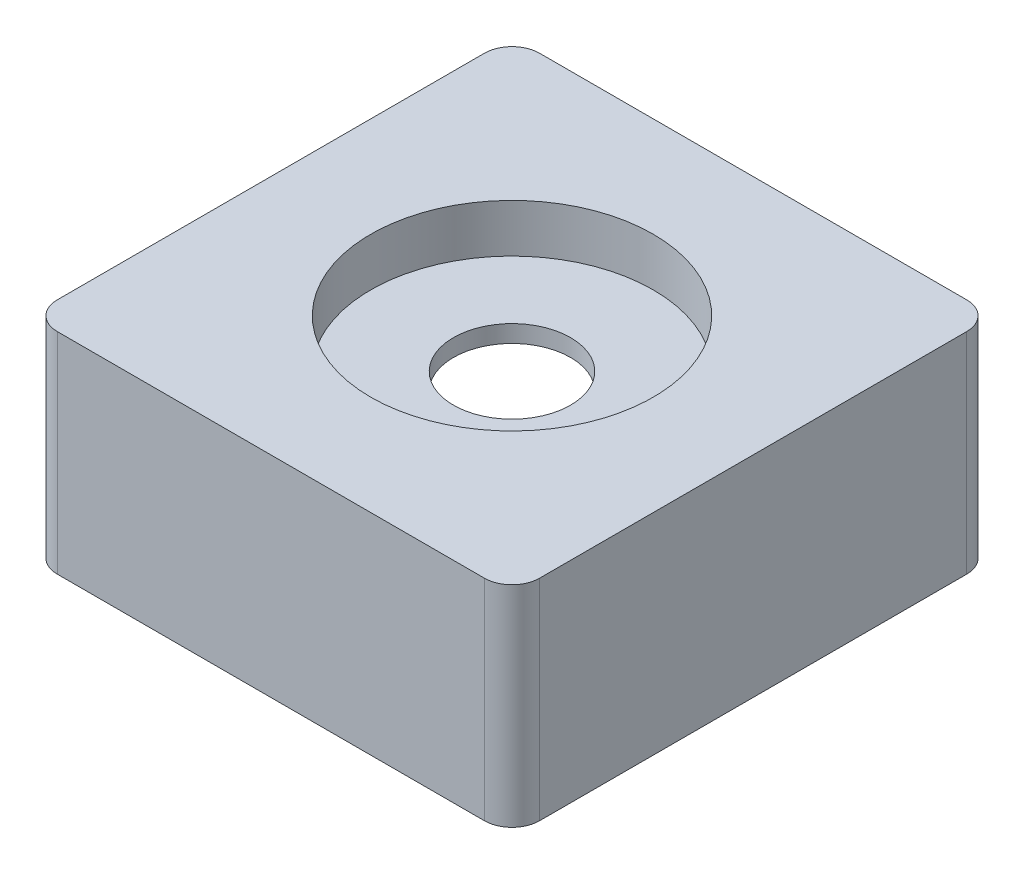
ISO-10303-21;
HEADER;
FILE_DESCRIPTION(('STEP AP214'),'2;1');
FILE_NAME('part.step','',(''),(''),'','','');
FILE_SCHEMA(('AUTOMOTIVE_DESIGN { 1 0 10303 214 1 1 1 1 }'));
ENDSEC;
DATA;
#1=APPLICATION_CONTEXT('core data for automotive mechanical design processes');
#2=APPLICATION_PROTOCOL_DEFINITION('international standard','automotive_design',2000,#1);
#3=PRODUCT_CONTEXT('',#1,'mechanical');
#4=PRODUCT('Part','Part','',(#3));
#5=PRODUCT_RELATED_PRODUCT_CATEGORY('part','',(#4));
#6=PRODUCT_DEFINITION_FORMATION('','',#4);
#7=PRODUCT_DEFINITION_CONTEXT('part definition',#1,'design');
#8=PRODUCT_DEFINITION('design','',#6,#7);
#9=PRODUCT_DEFINITION_SHAPE('','',#8);
#10=(LENGTH_UNIT() NAMED_UNIT(*) SI_UNIT(.MILLI.,.METRE.));
#11=(NAMED_UNIT(*) PLANE_ANGLE_UNIT() SI_UNIT($,.RADIAN.));
#12=(NAMED_UNIT(*) SI_UNIT($,.STERADIAN.) SOLID_ANGLE_UNIT());
#13=UNCERTAINTY_MEASURE_WITH_UNIT(LENGTH_MEASURE(1.E-05),#10,'distance_accuracy_value','');
#14=(GEOMETRIC_REPRESENTATION_CONTEXT(3) GLOBAL_UNCERTAINTY_ASSIGNED_CONTEXT((#13)) GLOBAL_UNIT_ASSIGNED_CONTEXT((#10,
#11,#12)) REPRESENTATION_CONTEXT('',''));
#15=CARTESIAN_POINT('',(0.,0.,0.));
#16=DIRECTION('',(0.,0.,1.));
#17=DIRECTION('',(1.,0.,0.));
#18=AXIS2_PLACEMENT_3D('',#15,#16,#17);
#19=CARTESIAN_POINT('',(0.,14.,0.));
#20=DIRECTION('',(0.,1.,0.));
#21=DIRECTION('',(0.,0.,1.));
#22=AXIS2_PLACEMENT_3D('',#19,#20,#21);
#23=PLANE('',#22);
#24=DIRECTION('',(0.,0.,1.));
#25=VECTOR('',#24,1.);
#26=CARTESIAN_POINT('',(-70.,14.,-70.));
#27=LINE('',#26,#25);
#28=CARTESIAN_POINT('',(-70.,14.,-62.));
#29=VERTEX_POINT('',#28);
#30=CARTESIAN_POINT('',(-70.,14.,62.));
#31=VERTEX_POINT('',#30);
#32=EDGE_CURVE('E280',#29,#31,#27,.T.);
#33=ORIENTED_EDGE('',*,*,#32,.T.);
#34=CARTESIAN_POINT('',(-62.,14.,62.));
#35=DIRECTION('',(0.,1.,0.));
#36=DIRECTION('',(0.,0.,1.));
#37=AXIS2_PLACEMENT_3D('',#34,#35,#36);
#38=CIRCLE('',#37,8.);
#39=CARTESIAN_POINT('',(-62.,14.,70.));
#40=VERTEX_POINT('',#39);
#41=EDGE_CURVE('E323',#31,#40,#38,.T.);
#42=ORIENTED_EDGE('',*,*,#41,.T.);
#43=DIRECTION('',(1.,0.,0.));
#44=VECTOR('',#43,1.);
#45=CARTESIAN_POINT('',(-70.,14.,70.));
#46=LINE('',#45,#44);
#47=CARTESIAN_POINT('',(62.,14.,70.));
#48=VERTEX_POINT('',#47);
#49=EDGE_CURVE('E284',#40,#48,#46,.T.);
#50=ORIENTED_EDGE('',*,*,#49,.T.);
#51=CARTESIAN_POINT('',(62.,14.,62.));
#52=DIRECTION('',(0.,1.,0.));
#53=DIRECTION('',(0.,0.,1.));
#54=AXIS2_PLACEMENT_3D('',#51,#52,#53);
#55=CIRCLE('',#54,8.);
#56=CARTESIAN_POINT('',(70.,14.,62.));
#57=VERTEX_POINT('',#56);
#58=EDGE_CURVE('E314',#48,#57,#55,.T.);
#59=ORIENTED_EDGE('',*,*,#58,.T.);
#60=DIRECTION('',(0.,0.,-1.));
#61=VECTOR('',#60,1.);
#62=CARTESIAN_POINT('',(70.,14.,-70.));
#63=LINE('',#62,#61);
#64=CARTESIAN_POINT('',(70.,14.,-62.));
#65=VERTEX_POINT('',#64);
#66=EDGE_CURVE('E270',#57,#65,#63,.T.);
#67=ORIENTED_EDGE('',*,*,#66,.T.);
#68=CARTESIAN_POINT('',(62.,14.,-62.));
#69=DIRECTION('',(0.,1.,0.));
#70=DIRECTION('',(0.,0.,1.));
#71=AXIS2_PLACEMENT_3D('',#68,#69,#70);
#72=CIRCLE('',#71,8.);
#73=CARTESIAN_POINT('',(62.,14.,-70.));
#74=VERTEX_POINT('',#73);
#75=EDGE_CURVE('E317',#65,#74,#72,.T.);
#76=ORIENTED_EDGE('',*,*,#75,.T.);
#77=DIRECTION('',(-1.,0.,0.));
#78=VECTOR('',#77,1.);
#79=CARTESIAN_POINT('',(-70.,14.,-70.));
#80=LINE('',#79,#78);
#81=CARTESIAN_POINT('',(-62.,14.,-70.));
#82=VERTEX_POINT('',#81);
#83=EDGE_CURVE('E277',#74,#82,#80,.T.);
#84=ORIENTED_EDGE('',*,*,#83,.T.);
#85=CARTESIAN_POINT('',(-62.,14.,-62.));
#86=DIRECTION('',(0.,1.,0.));
#87=DIRECTION('',(0.,0.,1.));
#88=AXIS2_PLACEMENT_3D('',#85,#86,#87);
#89=CIRCLE('',#88,8.);
#90=EDGE_CURVE('E320',#82,#29,#89,.T.);
#91=ORIENTED_EDGE('',*,*,#90,.T.);
#92=EDGE_LOOP('',(#33,#42,#50,#59,#67,#76,#84,#91));
#93=FACE_BOUND('',#92,.T.);
#94=CARTESIAN_POINT('',(0.,14.,0.));
#95=DIRECTION('',(0.,1.,0.));
#96=DIRECTION('',(0.,0.,1.));
#97=AXIS2_PLACEMENT_3D('',#94,#95,#96);
#98=CIRCLE('',#97,41.);
#99=CARTESIAN_POINT('',(0.,14.,41.));
#100=VERTEX_POINT('',#99);
#101=EDGE_CURVE('E266',#100,#100,#98,.T.);
#102=ORIENTED_EDGE('',*,*,#101,.F.);
#103=EDGE_LOOP('',(#102));
#104=FACE_BOUND('',#103,.T.);
#105=ADVANCED_FACE('F39',(#93,#104),#23,.T.);
#106=CARTESIAN_POINT('',(70.,14.,-70.));
#107=DIRECTION('',(-1.,0.,0.));
#108=DIRECTION('',(0.,0.,1.));
#109=AXIS2_PLACEMENT_3D('',#106,#107,#108);
#110=PLANE('',#109);
#111=DIRECTION('',(0.,0.,1.));
#112=VECTOR('',#111,1.);
#113=CARTESIAN_POINT('',(70.,-47.,70.));
#114=LINE('',#113,#112);
#115=CARTESIAN_POINT('',(70.,-47.,-62.));
#116=VERTEX_POINT('',#115);
#117=CARTESIAN_POINT('',(70.,-47.,62.));
#118=VERTEX_POINT('',#117);
#119=EDGE_CURVE('E240',#116,#118,#114,.T.);
#120=ORIENTED_EDGE('',*,*,#119,.F.);
#121=DIRECTION('',(0.,-1.,0.));
#122=VECTOR('',#121,1.);
#123=CARTESIAN_POINT('',(70.,14.,-62.));
#124=LINE('',#123,#122);
#125=EDGE_CURVE('E11',#116,#65,#124,.F.);
#126=ORIENTED_EDGE('',*,*,#125,.T.);
#127=ORIENTED_EDGE('',*,*,#66,.F.);
#128=DIRECTION('',(0.,-1.,0.));
#129=VECTOR('',#128,1.);
#130=CARTESIAN_POINT('',(70.,14.,62.));
#131=LINE('',#130,#129);
#132=EDGE_CURVE('E48',#57,#118,#131,.T.);
#133=ORIENTED_EDGE('',*,*,#132,.T.);
#134=EDGE_LOOP('',(#120,#126,#127,#133));
#135=FACE_BOUND('',#134,.T.);
#136=ADVANCED_FACE('F337',(#135),#110,.F.);
#137=CARTESIAN_POINT('',(-70.,14.,-70.));
#138=DIRECTION('',(0.,0.,1.));
#139=DIRECTION('',(1.,0.,0.));
#140=AXIS2_PLACEMENT_3D('',#137,#138,#139);
#141=PLANE('',#140);
#142=DIRECTION('',(1.,0.,0.));
#143=VECTOR('',#142,1.);
#144=CARTESIAN_POINT('',(-70.,-47.,-70.));
#145=LINE('',#144,#143);
#146=CARTESIAN_POINT('',(-62.,-47.,-70.));
#147=VERTEX_POINT('',#146);
#148=CARTESIAN_POINT('',(62.,-47.,-70.));
#149=VERTEX_POINT('',#148);
#150=EDGE_CURVE('E253',#147,#149,#145,.T.);
#151=ORIENTED_EDGE('',*,*,#150,.F.);
#152=DIRECTION('',(0.,-1.,0.));
#153=VECTOR('',#152,1.);
#154=CARTESIAN_POINT('',(-62.,14.,-70.));
#155=LINE('',#154,#153);
#156=EDGE_CURVE('E63',#147,#82,#155,.F.);
#157=ORIENTED_EDGE('',*,*,#156,.T.);
#158=ORIENTED_EDGE('',*,*,#83,.F.);
#159=DIRECTION('',(0.,-1.,0.));
#160=VECTOR('',#159,1.);
#161=CARTESIAN_POINT('',(62.,14.,-70.));
#162=LINE('',#161,#160);
#163=EDGE_CURVE('E326',#74,#149,#162,.T.);
#164=ORIENTED_EDGE('',*,*,#163,.T.);
#165=EDGE_LOOP('',(#151,#157,#158,#164));
#166=FACE_BOUND('',#165,.T.);
#167=ADVANCED_FACE('F350',(#166),#141,.F.);
#168=CARTESIAN_POINT('',(-70.,14.,-70.));
#169=DIRECTION('',(1.,0.,0.));
#170=DIRECTION('',(0.,0.,-1.));
#171=AXIS2_PLACEMENT_3D('',#168,#169,#170);
#172=PLANE('',#171);
#173=CARTESIAN_POINT('',(-70.,-32.,0.));
#174=DIRECTION('',(-1.,0.,0.));
#175=DIRECTION('',(0.,0.,1.));
#176=AXIS2_PLACEMENT_3D('',#173,#174,#175);
#177=CIRCLE('',#176,10.);
#178=CARTESIAN_POINT('',(-70.,-32.,10.));
#179=VERTEX_POINT('',#178);
#180=CARTESIAN_POINT('',(-70.,-32.,-10.));
#181=VERTEX_POINT('',#180);
#182=EDGE_CURVE('E160',#179,#181,#177,.T.);
#183=ORIENTED_EDGE('',*,*,#182,.F.);
#184=DIRECTION('',(0.,1.,0.));
#185=VECTOR('',#184,1.);
#186=CARTESIAN_POINT('',(-70.,-32.,10.));
#187=LINE('',#186,#185);
#188=CARTESIAN_POINT('',(-70.,-47.,10.));
#189=VERTEX_POINT('',#188);
#190=EDGE_CURVE('E176',#189,#179,#187,.T.);
#191=ORIENTED_EDGE('',*,*,#190,.F.);
#192=DIRECTION('',(0.,0.,-1.));
#193=VECTOR('',#192,1.);
#194=CARTESIAN_POINT('',(-70.,-47.,70.));
#195=LINE('',#194,#193);
#196=CARTESIAN_POINT('',(-70.,-47.,62.));
#197=VERTEX_POINT('',#196);
#198=EDGE_CURVE('E249',#197,#189,#195,.T.);
#199=ORIENTED_EDGE('',*,*,#198,.F.);
#200=DIRECTION('',(0.,-1.,0.));
#201=VECTOR('',#200,1.);
#202=CARTESIAN_POINT('',(-70.,14.,62.));
#203=LINE('',#202,#201);
#204=EDGE_CURVE('E311',#197,#31,#203,.F.);
#205=ORIENTED_EDGE('',*,*,#204,.T.);
#206=ORIENTED_EDGE('',*,*,#32,.F.);
#207=DIRECTION('',(0.,-1.,0.));
#208=VECTOR('',#207,1.);
#209=CARTESIAN_POINT('',(-70.,14.,-62.));
#210=LINE('',#209,#208);
#211=CARTESIAN_POINT('',(-70.,-47.,-62.));
#212=VERTEX_POINT('',#211);
#213=EDGE_CURVE('E307',#29,#212,#210,.T.);
#214=ORIENTED_EDGE('',*,*,#213,.T.);
#215=CARTESIAN_POINT('',(-70.,-47.,-10.));
#216=VERTEX_POINT('',#215);
#217=EDGE_CURVE('E248',#216,#212,#195,.T.);
#218=ORIENTED_EDGE('',*,*,#217,.F.);
#219=DIRECTION('',(0.,-1.,0.));
#220=VECTOR('',#219,1.);
#221=CARTESIAN_POINT('',(-70.,-32.,-10.));
#222=LINE('',#221,#220);
#223=EDGE_CURVE('E180',#181,#216,#222,.T.);
#224=ORIENTED_EDGE('',*,*,#223,.F.);
#225=EDGE_LOOP('',(#183,#191,#199,#205,#206,#214,#218,#224));
#226=FACE_BOUND('',#225,.T.);
#227=ADVANCED_FACE('F361',(#226),#172,.F.);
#228=CARTESIAN_POINT('',(-70.,14.,70.));
#229=DIRECTION('',(0.,0.,-1.));
#230=DIRECTION('',(-1.,0.,0.));
#231=AXIS2_PLACEMENT_3D('',#228,#229,#230);
#232=PLANE('',#231);
#233=ORIENTED_EDGE('',*,*,#49,.F.);
#234=DIRECTION('',(0.,-1.,0.));
#235=VECTOR('',#234,1.);
#236=CARTESIAN_POINT('',(-62.,14.,70.));
#237=LINE('',#236,#235);
#238=CARTESIAN_POINT('',(-62.,-47.,70.));
#239=VERTEX_POINT('',#238);
#240=EDGE_CURVE('E291',#40,#239,#237,.T.);
#241=ORIENTED_EDGE('',*,*,#240,.T.);
#242=DIRECTION('',(-1.,0.,0.));
#243=VECTOR('',#242,1.);
#244=CARTESIAN_POINT('',(-70.,-47.,70.));
#245=LINE('',#244,#243);
#246=CARTESIAN_POINT('',(62.,-47.,70.));
#247=VERTEX_POINT('',#246);
#248=EDGE_CURVE('E244',#247,#239,#245,.T.);
#249=ORIENTED_EDGE('',*,*,#248,.F.);
#250=DIRECTION('',(0.,-1.,0.));
#251=VECTOR('',#250,1.);
#252=CARTESIAN_POINT('',(62.,14.,70.));
#253=LINE('',#252,#251);
#254=EDGE_CURVE('E288',#247,#48,#253,.F.);
#255=ORIENTED_EDGE('',*,*,#254,.T.);
#256=EDGE_LOOP('',(#233,#241,#249,#255));
#257=FACE_BOUND('',#256,.T.);
#258=ADVANCED_FACE('F370',(#257),#232,.F.);
#259=CARTESIAN_POINT('',(0.,14.,0.));
#260=DIRECTION('',(0.,-1.,0.));
#261=DIRECTION('',(0.,0.,-1.));
#262=AXIS2_PLACEMENT_3D('',#259,#260,#261);
#263=CYLINDRICAL_SURFACE('',#262,41.);
#264=ORIENTED_EDGE('',*,*,#101,.T.);
#265=EDGE_LOOP('',(#264));
#266=FACE_BOUND('',#265,.T.);
#267=CARTESIAN_POINT('',(0.,0.,0.));
#268=DIRECTION('',(0.,1.,0.));
#269=DIRECTION('',(0.,0.,1.));
#270=AXIS2_PLACEMENT_3D('',#267,#268,#269);
#271=CIRCLE('',#270,41.);
#272=CARTESIAN_POINT('',(0.,0.,41.));
#273=VERTEX_POINT('',#272);
#274=EDGE_CURVE('E262',#273,#273,#271,.T.);
#275=ORIENTED_EDGE('',*,*,#274,.F.);
#276=EDGE_LOOP('',(#275));
#277=FACE_BOUND('',#276,.T.);
#278=ADVANCED_FACE('F393',(#266,#277),#263,.F.);
#279=CARTESIAN_POINT('',(0.,0.,0.));
#280=DIRECTION('',(0.,-1.,0.));
#281=DIRECTION('',(0.,0.,-1.));
#282=AXIS2_PLACEMENT_3D('',#279,#280,#281);
#283=PLANE('',#282);
#284=CARTESIAN_POINT('',(0.,0.,0.));
#285=DIRECTION('',(0.,-1.,0.));
#286=DIRECTION('',(0.,0.,-1.));
#287=AXIS2_PLACEMENT_3D('',#284,#285,#286);
#288=CIRCLE('',#287,17.);
#289=CARTESIAN_POINT('',(0.,0.,-17.));
#290=VERTEX_POINT('',#289);
#291=EDGE_CURVE('E257',#290,#290,#288,.T.);
#292=ORIENTED_EDGE('',*,*,#291,.T.);
#293=EDGE_LOOP('',(#292));
#294=FACE_BOUND('',#293,.T.);
#295=ORIENTED_EDGE('',*,*,#274,.T.);
#296=EDGE_LOOP('',(#295));
#297=FACE_BOUND('',#296,.T.);
#298=ADVANCED_FACE('F468',(#294,#297),#283,.F.);
#299=CARTESIAN_POINT('',(0.,-5.,0.));
#300=DIRECTION('',(0.,-1.,0.));
#301=DIRECTION('',(0.,0.,-1.));
#302=AXIS2_PLACEMENT_3D('',#299,#300,#301);
#303=PLANE('',#302);
#304=DIRECTION('',(0.,0.,1.));
#305=VECTOR('',#304,1.);
#306=CARTESIAN_POINT('',(60.,-5.,60.));
#307=LINE('',#306,#305);
#308=CARTESIAN_POINT('',(60.,-5.,-60.));
#309=VERTEX_POINT('',#308);
#310=CARTESIAN_POINT('',(60.,-5.,60.));
#311=VERTEX_POINT('',#310);
#312=EDGE_CURVE('E194',#309,#311,#307,.T.);
#313=ORIENTED_EDGE('',*,*,#312,.T.);
#314=DIRECTION('',(-1.,0.,0.));
#315=VECTOR('',#314,1.);
#316=CARTESIAN_POINT('',(-60.,-5.,60.));
#317=LINE('',#316,#315);
#318=CARTESIAN_POINT('',(-60.,-5.,60.));
#319=VERTEX_POINT('',#318);
#320=EDGE_CURVE('E217',#311,#319,#317,.T.);
#321=ORIENTED_EDGE('',*,*,#320,.T.);
#322=DIRECTION('',(0.,0.,-1.));
#323=VECTOR('',#322,1.);
#324=CARTESIAN_POINT('',(-60.,-5.,60.));
#325=LINE('',#324,#323);
#326=CARTESIAN_POINT('',(-60.,-5.,-60.));
#327=VERTEX_POINT('',#326);
#328=EDGE_CURVE('E220',#319,#327,#325,.T.);
#329=ORIENTED_EDGE('',*,*,#328,.T.);
#330=DIRECTION('',(1.,0.,0.));
#331=VECTOR('',#330,1.);
#332=CARTESIAN_POINT('',(-60.,-5.,-60.));
#333=LINE('',#332,#331);
#334=EDGE_CURVE('E204',#327,#309,#333,.T.);
#335=ORIENTED_EDGE('',*,*,#334,.T.);
#336=EDGE_LOOP('',(#313,#321,#329,#335));
#337=FACE_BOUND('',#336,.T.);
#338=CARTESIAN_POINT('',(0.,-5.,0.));
#339=DIRECTION('',(0.,-1.,0.));
#340=DIRECTION('',(0.,0.,-1.));
#341=AXIS2_PLACEMENT_3D('',#338,#339,#340);
#342=CIRCLE('',#341,17.);
#343=CARTESIAN_POINT('',(0.,-5.,-17.));
#344=VERTEX_POINT('',#343);
#345=EDGE_CURVE('E258',#344,#344,#342,.T.);
#346=ORIENTED_EDGE('',*,*,#345,.F.);
#347=EDGE_LOOP('',(#346));
#348=FACE_BOUND('',#347,.T.);
#349=ADVANCED_FACE('F475',(#337,#348),#303,.T.);
#350=CARTESIAN_POINT('',(0.,-5.,0.));
#351=DIRECTION('',(0.,1.,0.));
#352=DIRECTION('',(0.,0.,1.));
#353=AXIS2_PLACEMENT_3D('',#350,#351,#352);
#354=CYLINDRICAL_SURFACE('',#353,17.);
#355=ORIENTED_EDGE('',*,*,#345,.T.);
#356=EDGE_LOOP('',(#355));
#357=FACE_BOUND('',#356,.T.);
#358=ORIENTED_EDGE('',*,*,#291,.F.);
#359=EDGE_LOOP('',(#358));
#360=FACE_BOUND('',#359,.T.);
#361=ADVANCED_FACE('F442',(#357,#360),#354,.F.);
#362=CARTESIAN_POINT('',(0.,-47.,0.));
#363=DIRECTION('',(0.,-1.,0.));
#364=DIRECTION('',(0.,0.,-1.));
#365=AXIS2_PLACEMENT_3D('',#362,#363,#364);
#366=PLANE('',#365);
#367=DIRECTION('',(-1.,0.,0.));
#368=VECTOR('',#367,1.);
#369=CARTESIAN_POINT('',(-64.,-47.,10.));
#370=LINE('',#369,#368);
#371=CARTESIAN_POINT('',(-64.,-47.,10.));
#372=VERTEX_POINT('',#371);
#373=EDGE_CURVE('E195',#372,#189,#370,.T.);
#374=ORIENTED_EDGE('',*,*,#373,.F.);
#375=DIRECTION('',(0.,0.,1.));
#376=VECTOR('',#375,1.);
#377=CARTESIAN_POINT('',(-64.,-47.,-10.));
#378=LINE('',#377,#376);
#379=CARTESIAN_POINT('',(-64.,-47.,-10.));
#380=VERTEX_POINT('',#379);
#381=EDGE_CURVE('E171',#380,#372,#378,.T.);
#382=ORIENTED_EDGE('',*,*,#381,.F.);
#383=DIRECTION('',(-1.,0.,0.));
#384=VECTOR('',#383,1.);
#385=CARTESIAN_POINT('',(-64.,-47.,-10.));
#386=LINE('',#385,#384);
#387=EDGE_CURVE('E164',#380,#216,#386,.T.);
#388=ORIENTED_EDGE('',*,*,#387,.T.);
#389=ORIENTED_EDGE('',*,*,#217,.T.);
#390=CARTESIAN_POINT('',(-62.,-47.,-62.));
#391=DIRECTION('',(0.,-1.,0.));
#392=DIRECTION('',(0.,0.,-1.));
#393=AXIS2_PLACEMENT_3D('',#390,#391,#392);
#394=CIRCLE('',#393,8.);
#395=EDGE_CURVE('E301',#212,#147,#394,.T.);
#396=ORIENTED_EDGE('',*,*,#395,.T.);
#397=ORIENTED_EDGE('',*,*,#150,.T.);
#398=CARTESIAN_POINT('',(62.,-47.,-62.));
#399=DIRECTION('',(0.,-1.,0.));
#400=DIRECTION('',(0.,0.,-1.));
#401=AXIS2_PLACEMENT_3D('',#398,#399,#400);
#402=CIRCLE('',#401,8.);
#403=EDGE_CURVE('E298',#149,#116,#402,.T.);
#404=ORIENTED_EDGE('',*,*,#403,.T.);
#405=ORIENTED_EDGE('',*,*,#119,.T.);
#406=CARTESIAN_POINT('',(62.,-47.,62.));
#407=DIRECTION('',(0.,-1.,0.));
#408=DIRECTION('',(0.,0.,-1.));
#409=AXIS2_PLACEMENT_3D('',#406,#407,#408);
#410=CIRCLE('',#409,8.);
#411=EDGE_CURVE('E295',#118,#247,#410,.T.);
#412=ORIENTED_EDGE('',*,*,#411,.T.);
#413=ORIENTED_EDGE('',*,*,#248,.T.);
#414=CARTESIAN_POINT('',(-62.,-47.,62.));
#415=DIRECTION('',(0.,-1.,0.));
#416=DIRECTION('',(0.,0.,-1.));
#417=AXIS2_PLACEMENT_3D('',#414,#415,#416);
#418=CIRCLE('',#417,8.);
#419=EDGE_CURVE('E304',#239,#197,#418,.T.);
#420=ORIENTED_EDGE('',*,*,#419,.T.);
#421=ORIENTED_EDGE('',*,*,#198,.T.);
#422=EDGE_LOOP('',(#374,#382,#388,#389,#396,#397,#404,#405,#412,#413,#420,#421));
#423=FACE_BOUND('',#422,.T.);
#424=DIRECTION('',(-1.,0.,0.));
#425=VECTOR('',#424,1.);
#426=CARTESIAN_POINT('',(-60.,-47.,60.));
#427=LINE('',#426,#425);
#428=CARTESIAN_POINT('',(60.,-47.,60.));
#429=VERTEX_POINT('',#428);
#430=CARTESIAN_POINT('',(-60.,-47.,60.));
#431=VERTEX_POINT('',#430);
#432=EDGE_CURVE('E203',#429,#431,#427,.T.);
#433=ORIENTED_EDGE('',*,*,#432,.F.);
#434=DIRECTION('',(0.,0.,1.));
#435=VECTOR('',#434,1.);
#436=CARTESIAN_POINT('',(60.,-47.,60.));
#437=LINE('',#436,#435);
#438=CARTESIAN_POINT('',(60.,-47.,-60.));
#439=VERTEX_POINT('',#438);
#440=EDGE_CURVE('E200',#439,#429,#437,.T.);
#441=ORIENTED_EDGE('',*,*,#440,.F.);
#442=DIRECTION('',(1.,0.,0.));
#443=VECTOR('',#442,1.);
#444=CARTESIAN_POINT('',(-60.,-47.,-60.));
#445=LINE('',#444,#443);
#446=CARTESIAN_POINT('',(-60.,-47.,-60.));
#447=VERTEX_POINT('',#446);
#448=EDGE_CURVE('E211',#447,#439,#445,.T.);
#449=ORIENTED_EDGE('',*,*,#448,.F.);
#450=DIRECTION('',(0.,0.,-1.));
#451=VECTOR('',#450,1.);
#452=CARTESIAN_POINT('',(-60.,-47.,60.));
#453=LINE('',#452,#451);
#454=EDGE_CURVE('E207',#431,#447,#453,.T.);
#455=ORIENTED_EDGE('',*,*,#454,.F.);
#456=EDGE_LOOP('',(#433,#441,#449,#455));
#457=FACE_BOUND('',#456,.T.);
#458=ADVANCED_FACE('F343',(#423,#457),#366,.T.);
#459=CARTESIAN_POINT('',(60.,-47.,60.));
#460=DIRECTION('',(-1.,0.,0.));
#461=DIRECTION('',(0.,0.,1.));
#462=AXIS2_PLACEMENT_3D('',#459,#460,#461);
#463=PLANE('',#462);
#464=ORIENTED_EDGE('',*,*,#312,.F.);
#465=DIRECTION('',(0.,1.,0.));
#466=VECTOR('',#465,1.);
#467=CARTESIAN_POINT('',(60.,-47.,-60.));
#468=LINE('',#467,#466);
#469=EDGE_CURVE('E214',#439,#309,#468,.T.);
#470=ORIENTED_EDGE('',*,*,#469,.F.);
#471=ORIENTED_EDGE('',*,*,#440,.T.);
#472=DIRECTION('',(0.,1.,0.));
#473=VECTOR('',#472,1.);
#474=CARTESIAN_POINT('',(60.,-47.,60.));
#475=LINE('',#474,#473);
#476=EDGE_CURVE('E236',#429,#311,#475,.T.);
#477=ORIENTED_EDGE('',*,*,#476,.T.);
#478=EDGE_LOOP('',(#464,#470,#471,#477));
#479=FACE_BOUND('',#478,.T.);
#480=ADVANCED_FACE('F441',(#479),#463,.T.);
#481=CARTESIAN_POINT('',(-60.,-47.,60.));
#482=DIRECTION('',(0.,0.,-1.));
#483=DIRECTION('',(-1.,0.,0.));
#484=AXIS2_PLACEMENT_3D('',#481,#482,#483);
#485=PLANE('',#484);
#486=ORIENTED_EDGE('',*,*,#320,.F.);
#487=ORIENTED_EDGE('',*,*,#476,.F.);
#488=ORIENTED_EDGE('',*,*,#432,.T.);
#489=DIRECTION('',(0.,1.,0.));
#490=VECTOR('',#489,1.);
#491=CARTESIAN_POINT('',(-60.,-47.,60.));
#492=LINE('',#491,#490);
#493=EDGE_CURVE('E232',#431,#319,#492,.T.);
#494=ORIENTED_EDGE('',*,*,#493,.T.);
#495=EDGE_LOOP('',(#486,#487,#488,#494));
#496=FACE_BOUND('',#495,.T.);
#497=ADVANCED_FACE('F553',(#496),#485,.T.);
#498=CARTESIAN_POINT('',(-60.,-47.,60.));
#499=DIRECTION('',(1.,0.,0.));
#500=DIRECTION('',(0.,0.,-1.));
#501=AXIS2_PLACEMENT_3D('',#498,#499,#500);
#502=PLANE('',#501);
#503=ORIENTED_EDGE('',*,*,#328,.F.);
#504=ORIENTED_EDGE('',*,*,#493,.F.);
#505=ORIENTED_EDGE('',*,*,#454,.T.);
#506=DIRECTION('',(0.,1.,0.));
#507=VECTOR('',#506,1.);
#508=CARTESIAN_POINT('',(-60.,-47.,-60.));
#509=LINE('',#508,#507);
#510=EDGE_CURVE('E228',#447,#327,#509,.T.);
#511=ORIENTED_EDGE('',*,*,#510,.T.);
#512=EDGE_LOOP('',(#503,#504,#505,#511));
#513=FACE_BOUND('',#512,.T.);
#514=ADVANCED_FACE('F542',(#513),#502,.T.);
#515=CARTESIAN_POINT('',(-60.,-47.,-60.));
#516=DIRECTION('',(0.,0.,1.));
#517=DIRECTION('',(1.,0.,0.));
#518=AXIS2_PLACEMENT_3D('',#515,#516,#517);
#519=PLANE('',#518);
#520=ORIENTED_EDGE('',*,*,#334,.F.);
#521=ORIENTED_EDGE('',*,*,#510,.F.);
#522=ORIENTED_EDGE('',*,*,#448,.T.);
#523=ORIENTED_EDGE('',*,*,#469,.T.);
#524=EDGE_LOOP('',(#520,#521,#522,#523));
#525=FACE_BOUND('',#524,.T.);
#526=ADVANCED_FACE('F403',(#525),#519,.T.);
#527=CARTESIAN_POINT('',(-62.,14.,62.));
#528=DIRECTION('',(0.,-1.,0.));
#529=DIRECTION('',(0.,0.,-1.));
#530=AXIS2_PLACEMENT_3D('',#527,#528,#529);
#531=CYLINDRICAL_SURFACE('',#530,8.);
#532=ORIENTED_EDGE('',*,*,#41,.F.);
#533=ORIENTED_EDGE('',*,*,#204,.F.);
#534=ORIENTED_EDGE('',*,*,#419,.F.);
#535=ORIENTED_EDGE('',*,*,#240,.F.);
#536=EDGE_LOOP('',(#532,#533,#534,#535));
#537=FACE_BOUND('',#536,.T.);
#538=ADVANCED_FACE('F368',(#537),#531,.T.);
#539=CARTESIAN_POINT('',(-62.,14.,-62.));
#540=DIRECTION('',(0.,-1.,0.));
#541=DIRECTION('',(0.,0.,-1.));
#542=AXIS2_PLACEMENT_3D('',#539,#540,#541);
#543=CYLINDRICAL_SURFACE('',#542,8.);
#544=ORIENTED_EDGE('',*,*,#90,.F.);
#545=ORIENTED_EDGE('',*,*,#156,.F.);
#546=ORIENTED_EDGE('',*,*,#395,.F.);
#547=ORIENTED_EDGE('',*,*,#213,.F.);
#548=EDGE_LOOP('',(#544,#545,#546,#547));
#549=FACE_BOUND('',#548,.T.);
#550=ADVANCED_FACE('F357',(#549),#543,.T.);
#551=CARTESIAN_POINT('',(62.,14.,-62.));
#552=DIRECTION('',(0.,-1.,0.));
#553=DIRECTION('',(0.,0.,-1.));
#554=AXIS2_PLACEMENT_3D('',#551,#552,#553);
#555=CYLINDRICAL_SURFACE('',#554,8.);
#556=ORIENTED_EDGE('',*,*,#75,.F.);
#557=ORIENTED_EDGE('',*,*,#125,.F.);
#558=ORIENTED_EDGE('',*,*,#403,.F.);
#559=ORIENTED_EDGE('',*,*,#163,.F.);
#560=EDGE_LOOP('',(#556,#557,#558,#559));
#561=FACE_BOUND('',#560,.T.);
#562=ADVANCED_FACE('F349',(#561),#555,.T.);
#563=CARTESIAN_POINT('',(62.,14.,62.));
#564=DIRECTION('',(0.,-1.,0.));
#565=DIRECTION('',(0.,0.,-1.));
#566=AXIS2_PLACEMENT_3D('',#563,#564,#565);
#567=CYLINDRICAL_SURFACE('',#566,8.);
#568=ORIENTED_EDGE('',*,*,#58,.F.);
#569=ORIENTED_EDGE('',*,*,#254,.F.);
#570=ORIENTED_EDGE('',*,*,#411,.F.);
#571=ORIENTED_EDGE('',*,*,#132,.F.);
#572=EDGE_LOOP('',(#568,#569,#570,#571));
#573=FACE_BOUND('',#572,.T.);
#574=ADVANCED_FACE('F41',(#573),#567,.T.);
#575=CARTESIAN_POINT('',(-64.,-32.,0.));
#576=DIRECTION('',(-1.,0.,0.));
#577=DIRECTION('',(0.,0.,1.));
#578=AXIS2_PLACEMENT_3D('',#575,#576,#577);
#579=CYLINDRICAL_SURFACE('',#578,10.);
#580=ORIENTED_EDGE('',*,*,#182,.T.);
#581=DIRECTION('',(-1.,0.,0.));
#582=VECTOR('',#581,1.);
#583=CARTESIAN_POINT('',(-64.,-32.,-10.));
#584=LINE('',#583,#582);
#585=CARTESIAN_POINT('',(-64.,-32.,-10.));
#586=VERTEX_POINT('',#585);
#587=EDGE_CURVE('E155',#586,#181,#584,.T.);
#588=ORIENTED_EDGE('',*,*,#587,.F.);
#589=CARTESIAN_POINT('',(-64.,-32.,0.));
#590=DIRECTION('',(-1.,0.,0.));
#591=DIRECTION('',(0.,0.,1.));
#592=AXIS2_PLACEMENT_3D('',#589,#590,#591);
#593=CIRCLE('',#592,10.);
#594=CARTESIAN_POINT('',(-64.,-32.,10.));
#595=VERTEX_POINT('',#594);
#596=EDGE_CURVE('E157',#595,#586,#593,.T.);
#597=ORIENTED_EDGE('',*,*,#596,.F.);
#598=DIRECTION('',(-1.,0.,0.));
#599=VECTOR('',#598,1.);
#600=CARTESIAN_POINT('',(-64.,-32.,10.));
#601=LINE('',#600,#599);
#602=EDGE_CURVE('E191',#595,#179,#601,.T.);
#603=ORIENTED_EDGE('',*,*,#602,.T.);
#604=EDGE_LOOP('',(#580,#588,#597,#603));
#605=FACE_BOUND('',#604,.T.);
#606=ADVANCED_FACE('F156',(#605),#579,.F.);
#607=CARTESIAN_POINT('',(-64.,-32.,10.));
#608=DIRECTION('',(0.,0.,1.));
#609=DIRECTION('',(0.,-1.,0.));
#610=AXIS2_PLACEMENT_3D('',#607,#608,#609);
#611=PLANE('',#610);
#612=ORIENTED_EDGE('',*,*,#190,.T.);
#613=ORIENTED_EDGE('',*,*,#602,.F.);
#614=DIRECTION('',(0.,1.,0.));
#615=VECTOR('',#614,1.);
#616=CARTESIAN_POINT('',(-64.,-32.,10.));
#617=LINE('',#616,#615);
#618=EDGE_CURVE('E165',#372,#595,#617,.T.);
#619=ORIENTED_EDGE('',*,*,#618,.F.);
#620=ORIENTED_EDGE('',*,*,#373,.T.);
#621=EDGE_LOOP('',(#612,#613,#619,#620));
#622=FACE_BOUND('',#621,.T.);
#623=ADVANCED_FACE('F374',(#622),#611,.F.);
#624=CARTESIAN_POINT('',(-64.,-32.,-10.));
#625=DIRECTION('',(0.,0.,-1.));
#626=DIRECTION('',(0.,1.,0.));
#627=AXIS2_PLACEMENT_3D('',#624,#625,#626);
#628=PLANE('',#627);
#629=ORIENTED_EDGE('',*,*,#223,.T.);
#630=ORIENTED_EDGE('',*,*,#387,.F.);
#631=DIRECTION('',(0.,-1.,0.));
#632=VECTOR('',#631,1.);
#633=CARTESIAN_POINT('',(-64.,-32.,-10.));
#634=LINE('',#633,#632);
#635=EDGE_CURVE('E55',#586,#380,#634,.T.);
#636=ORIENTED_EDGE('',*,*,#635,.F.);
#637=ORIENTED_EDGE('',*,*,#587,.T.);
#638=EDGE_LOOP('',(#629,#630,#636,#637));
#639=FACE_BOUND('',#638,.T.);
#640=ADVANCED_FACE('F167',(#639),#628,.F.);
#641=CARTESIAN_POINT('',(-64.,-32.,0.));
#642=DIRECTION('',(-1.,0.,0.));
#643=DIRECTION('',(0.,0.,1.));
#644=AXIS2_PLACEMENT_3D('',#641,#642,#643);
#645=PLANE('',#644);
#646=ORIENTED_EDGE('',*,*,#596,.T.);
#647=ORIENTED_EDGE('',*,*,#635,.T.);
#648=ORIENTED_EDGE('',*,*,#381,.T.);
#649=ORIENTED_EDGE('',*,*,#618,.T.);
#650=EDGE_LOOP('',(#646,#647,#648,#649));
#651=FACE_BOUND('',#650,.T.);
#652=ADVANCED_FACE('F173',(#651),#645,.T.);
#653=CLOSED_SHELL('',(#105,#136,#167,#227,#258,#278,#298,#349,#361,#458,#480,#497,#514,#526,
#538,#550,#562,#574,#606,#623,#640,#652));
#654=MANIFOLD_SOLID_BREP('B2',#653);
#655=ADVANCED_BREP_SHAPE_REPRESENTATION('',(#18,#654),#14);
#656=SHAPE_DEFINITION_REPRESENTATION(#9,#655);
ENDSEC;
END-ISO-10303-21;
